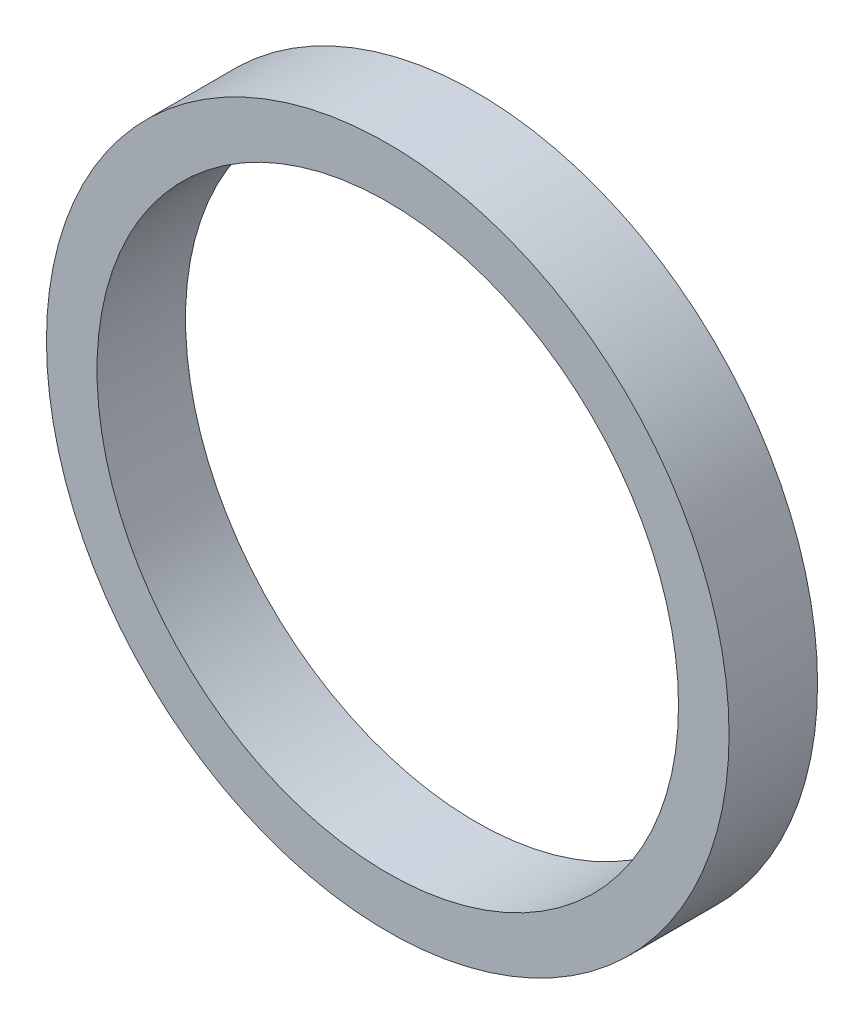
ISO-10303-21;
HEADER;
FILE_DESCRIPTION(('STEP AP214'),'2;1');
FILE_NAME('part.step','',(''),(''),'','','');
FILE_SCHEMA(('AUTOMOTIVE_DESIGN { 1 0 10303 214 1 1 1 1 }'));
ENDSEC;
DATA;
#1=APPLICATION_CONTEXT('core data for automotive mechanical design processes');
#2=APPLICATION_PROTOCOL_DEFINITION('international standard','automotive_design',2000,#1);
#3=PRODUCT_CONTEXT('',#1,'mechanical');
#4=PRODUCT('Part','Part','',(#3));
#5=PRODUCT_RELATED_PRODUCT_CATEGORY('part','',(#4));
#6=PRODUCT_DEFINITION_FORMATION('','',#4);
#7=PRODUCT_DEFINITION_CONTEXT('part definition',#1,'design');
#8=PRODUCT_DEFINITION('design','',#6,#7);
#9=PRODUCT_DEFINITION_SHAPE('','',#8);
#10=(LENGTH_UNIT() NAMED_UNIT(*) SI_UNIT(.MILLI.,.METRE.));
#11=(NAMED_UNIT(*) PLANE_ANGLE_UNIT() SI_UNIT($,.RADIAN.));
#12=(NAMED_UNIT(*) SI_UNIT($,.STERADIAN.) SOLID_ANGLE_UNIT());
#13=UNCERTAINTY_MEASURE_WITH_UNIT(LENGTH_MEASURE(1.E-05),#10,'distance_accuracy_value','');
#14=(GEOMETRIC_REPRESENTATION_CONTEXT(3) GLOBAL_UNCERTAINTY_ASSIGNED_CONTEXT((#13)) GLOBAL_UNIT_ASSIGNED_CONTEXT((#10,
#11,#12)) REPRESENTATION_CONTEXT('',''));
#15=CARTESIAN_POINT('',(0.,0.,0.));
#16=DIRECTION('',(0.,0.,1.));
#17=DIRECTION('',(1.,0.,0.));
#18=AXIS2_PLACEMENT_3D('',#15,#16,#17);
#19=CARTESIAN_POINT('',(0.,0.,7.));
#20=DIRECTION('',(0.,0.,1.));
#21=DIRECTION('',(1.,0.,0.));
#22=AXIS2_PLACEMENT_3D('',#19,#20,#21);
#23=PLANE('',#22);
#24=CARTESIAN_POINT('',(0.,0.,7.));
#25=DIRECTION('',(0.,0.,1.));
#26=DIRECTION('',(1.,0.,0.));
#27=AXIS2_PLACEMENT_3D('',#24,#25,#26);
#28=CIRCLE('',#27,27.);
#29=CARTESIAN_POINT('',(27.,0.,7.));
#30=VERTEX_POINT('',#29);
#31=EDGE_CURVE('E10',#30,#30,#28,.T.);
#32=ORIENTED_EDGE('',*,*,#31,.T.);
#33=EDGE_LOOP('',(#32));
#34=FACE_BOUND('',#33,.T.);
#35=CARTESIAN_POINT('',(0.,0.,7.));
#36=DIRECTION('',(0.,0.,1.));
#37=DIRECTION('',(1.,0.,0.));
#38=AXIS2_PLACEMENT_3D('',#35,#36,#37);
#39=CIRCLE('',#38,23.);
#40=CARTESIAN_POINT('',(23.,0.,7.));
#41=VERTEX_POINT('',#40);
#42=EDGE_CURVE('E42',#41,#41,#39,.T.);
#43=ORIENTED_EDGE('',*,*,#42,.F.);
#44=EDGE_LOOP('',(#43));
#45=FACE_BOUND('',#44,.T.);
#46=ADVANCED_FACE('F31',(#34,#45),#23,.T.);
#47=CARTESIAN_POINT('',(0.,0.,0.));
#48=DIRECTION('',(0.,0.,1.));
#49=DIRECTION('',(1.,0.,0.));
#50=AXIS2_PLACEMENT_3D('',#47,#48,#49);
#51=PLANE('',#50);
#52=CARTESIAN_POINT('',(0.,0.,0.));
#53=DIRECTION('',(0.,0.,1.));
#54=DIRECTION('',(1.,0.,0.));
#55=AXIS2_PLACEMENT_3D('',#52,#53,#54);
#56=CIRCLE('',#55,27.);
#57=CARTESIAN_POINT('',(27.,0.,0.));
#58=VERTEX_POINT('',#57);
#59=EDGE_CURVE('E35',#58,#58,#56,.T.);
#60=ORIENTED_EDGE('',*,*,#59,.F.);
#61=EDGE_LOOP('',(#60));
#62=FACE_BOUND('',#61,.T.);
#63=CARTESIAN_POINT('',(0.,0.,0.));
#64=DIRECTION('',(0.,0.,1.));
#65=DIRECTION('',(1.,0.,0.));
#66=AXIS2_PLACEMENT_3D('',#63,#64,#65);
#67=CIRCLE('',#66,23.);
#68=CARTESIAN_POINT('',(23.,0.,0.));
#69=VERTEX_POINT('',#68);
#70=EDGE_CURVE('E44',#69,#69,#67,.T.);
#71=ORIENTED_EDGE('',*,*,#70,.T.);
#72=EDGE_LOOP('',(#71));
#73=FACE_BOUND('',#72,.T.);
#74=ADVANCED_FACE('F54',(#62,#73),#51,.F.);
#75=CARTESIAN_POINT('',(0.,0.,7.));
#76=DIRECTION('',(0.,0.,-1.));
#77=DIRECTION('',(-1.,0.,0.));
#78=AXIS2_PLACEMENT_3D('',#75,#76,#77);
#79=CYLINDRICAL_SURFACE('',#78,27.);
#80=ORIENTED_EDGE('',*,*,#31,.F.);
#81=EDGE_LOOP('',(#80));
#82=FACE_BOUND('',#81,.T.);
#83=ORIENTED_EDGE('',*,*,#59,.T.);
#84=EDGE_LOOP('',(#83));
#85=FACE_BOUND('',#84,.T.);
#86=ADVANCED_FACE('F33',(#82,#85),#79,.T.);
#87=CARTESIAN_POINT('',(0.,0.,7.));
#88=DIRECTION('',(0.,0.,-1.));
#89=DIRECTION('',(-1.,0.,0.));
#90=AXIS2_PLACEMENT_3D('',#87,#88,#89);
#91=CYLINDRICAL_SURFACE('',#90,23.);
#92=ORIENTED_EDGE('',*,*,#42,.T.);
#93=EDGE_LOOP('',(#92));
#94=FACE_BOUND('',#93,.T.);
#95=ORIENTED_EDGE('',*,*,#70,.F.);
#96=EDGE_LOOP('',(#95));
#97=FACE_BOUND('',#96,.T.);
#98=ADVANCED_FACE('F50',(#94,#97),#91,.F.);
#99=CLOSED_SHELL('',(#46,#74,#86,#98));
#100=MANIFOLD_SOLID_BREP('B2',#99);
#101=ADVANCED_BREP_SHAPE_REPRESENTATION('',(#18,#100),#14);
#102=SHAPE_DEFINITION_REPRESENTATION(#9,#101);
ENDSEC;
END-ISO-10303-21;
